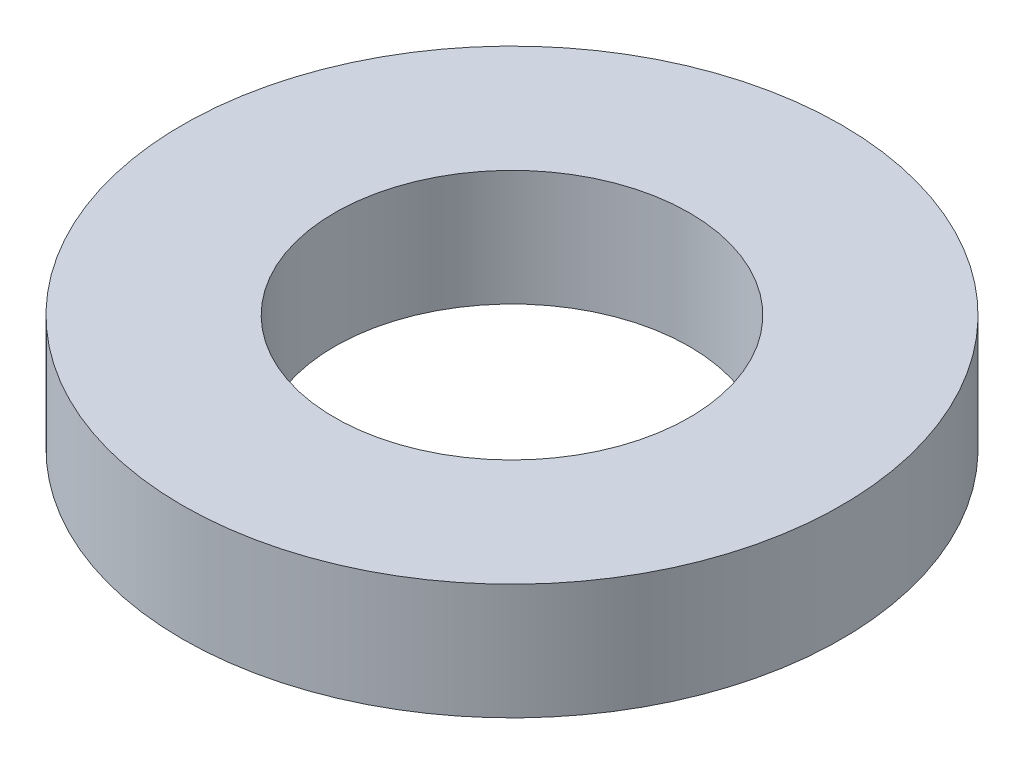
ISO-10303-21;
HEADER;
FILE_DESCRIPTION(('STEP AP214'),'2;1');
FILE_NAME('part.step','',(''),(''),'','','');
FILE_SCHEMA(('AUTOMOTIVE_DESIGN { 1 0 10303 214 1 1 1 1 }'));
ENDSEC;
DATA;
#1=APPLICATION_CONTEXT('core data for automotive mechanical design processes');
#2=APPLICATION_PROTOCOL_DEFINITION('international standard','automotive_design',2000,#1);
#3=PRODUCT_CONTEXT('',#1,'mechanical');
#4=PRODUCT('Part','Part','',(#3));
#5=PRODUCT_RELATED_PRODUCT_CATEGORY('part','',(#4));
#6=PRODUCT_DEFINITION_FORMATION('','',#4);
#7=PRODUCT_DEFINITION_CONTEXT('part definition',#1,'design');
#8=PRODUCT_DEFINITION('design','',#6,#7);
#9=PRODUCT_DEFINITION_SHAPE('','',#8);
#10=(LENGTH_UNIT() NAMED_UNIT(*) SI_UNIT(.MILLI.,.METRE.));
#11=(NAMED_UNIT(*) PLANE_ANGLE_UNIT() SI_UNIT($,.RADIAN.));
#12=(NAMED_UNIT(*) SI_UNIT($,.STERADIAN.) SOLID_ANGLE_UNIT());
#13=UNCERTAINTY_MEASURE_WITH_UNIT(LENGTH_MEASURE(1.E-05),#10,'distance_accuracy_value','');
#14=(GEOMETRIC_REPRESENTATION_CONTEXT(3) GLOBAL_UNCERTAINTY_ASSIGNED_CONTEXT((#13)) GLOBAL_UNIT_ASSIGNED_CONTEXT((#10,
#11,#12)) REPRESENTATION_CONTEXT('',''));
#15=CARTESIAN_POINT('',(0.,0.,0.));
#16=DIRECTION('',(0.,0.,1.));
#17=DIRECTION('',(1.,0.,0.));
#18=AXIS2_PLACEMENT_3D('',#15,#16,#17);
#19=CARTESIAN_POINT('',(0.,1.5748,0.));
#20=DIRECTION('',(0.,1.,0.));
#21=DIRECTION('',(0.,0.,1.));
#22=AXIS2_PLACEMENT_3D('',#19,#20,#21);
#23=PLANE('',#22);
#24=CARTESIAN_POINT('',(0.,1.5748,0.));
#25=DIRECTION('',(0.,-1.,0.));
#26=DIRECTION('',(0.,0.,-1.));
#27=AXIS2_PLACEMENT_3D('',#24,#25,#26);
#28=CIRCLE('',#27,2.413);
#29=CARTESIAN_POINT('',(0.,1.5748,-2.413));
#30=VERTEX_POINT('',#29);
#31=EDGE_CURVE('E27',#30,#30,#28,.T.);
#32=ORIENTED_EDGE('',*,*,#31,.T.);
#33=EDGE_LOOP('',(#32));
#34=FACE_BOUND('',#33,.T.);
#35=CARTESIAN_POINT('',(0.,1.5748,0.));
#36=DIRECTION('',(0.,-1.,0.));
#37=DIRECTION('',(0.,0.,-1.));
#38=AXIS2_PLACEMENT_3D('',#35,#36,#37);
#39=CIRCLE('',#38,4.4831);
#40=CARTESIAN_POINT('',(0.,1.5748,-4.4831));
#41=VERTEX_POINT('',#40);
#42=EDGE_CURVE('E18',#41,#41,#39,.T.);
#43=ORIENTED_EDGE('',*,*,#42,.F.);
#44=EDGE_LOOP('',(#43));
#45=FACE_BOUND('',#44,.T.);
#46=ADVANCED_FACE('F15',(#34,#45),#23,.T.);
#47=CARTESIAN_POINT('',(0.,1.5748,0.));
#48=DIRECTION('',(0.,-1.,0.));
#49=DIRECTION('',(0.,0.,-1.));
#50=AXIS2_PLACEMENT_3D('',#47,#48,#49);
#51=CYLINDRICAL_SURFACE('',#50,4.4831);
#52=ORIENTED_EDGE('',*,*,#42,.T.);
#53=EDGE_LOOP('',(#52));
#54=FACE_BOUND('',#53,.T.);
#55=CARTESIAN_POINT('',(0.,0.,0.));
#56=DIRECTION('',(0.,-1.,0.));
#57=DIRECTION('',(0.,0.,-1.));
#58=AXIS2_PLACEMENT_3D('',#55,#56,#57);
#59=CIRCLE('',#58,4.4831);
#60=CARTESIAN_POINT('',(0.,0.,-4.4831));
#61=VERTEX_POINT('',#60);
#62=EDGE_CURVE('E22',#61,#61,#59,.F.);
#63=ORIENTED_EDGE('',*,*,#62,.T.);
#64=EDGE_LOOP('',(#63));
#65=FACE_BOUND('',#64,.T.);
#66=ADVANCED_FACE('F35',(#54,#65),#51,.T.);
#67=CARTESIAN_POINT('',(0.,1.5748,0.));
#68=DIRECTION('',(0.,-1.,0.));
#69=DIRECTION('',(0.,0.,-1.));
#70=AXIS2_PLACEMENT_3D('',#67,#68,#69);
#71=CYLINDRICAL_SURFACE('',#70,2.413);
#72=CARTESIAN_POINT('',(0.,0.,0.));
#73=DIRECTION('',(0.,-1.,0.));
#74=DIRECTION('',(0.,0.,-1.));
#75=AXIS2_PLACEMENT_3D('',#72,#73,#74);
#76=CIRCLE('',#75,2.413);
#77=CARTESIAN_POINT('',(0.,0.,-2.413));
#78=VERTEX_POINT('',#77);
#79=EDGE_CURVE('E10',#78,#78,#76,.T.);
#80=ORIENTED_EDGE('',*,*,#79,.T.);
#81=EDGE_LOOP('',(#80));
#82=FACE_BOUND('',#81,.T.);
#83=ORIENTED_EDGE('',*,*,#31,.F.);
#84=EDGE_LOOP('',(#83));
#85=FACE_BOUND('',#84,.T.);
#86=ADVANCED_FACE('F43',(#82,#85),#71,.F.);
#87=CARTESIAN_POINT('',(0.,0.,0.));
#88=DIRECTION('',(0.,1.,0.));
#89=DIRECTION('',(0.,0.,1.));
#90=AXIS2_PLACEMENT_3D('',#87,#88,#89);
#91=PLANE('',#90);
#92=ORIENTED_EDGE('',*,*,#79,.F.);
#93=EDGE_LOOP('',(#92));
#94=FACE_BOUND('',#93,.T.);
#95=ORIENTED_EDGE('',*,*,#62,.F.);
#96=EDGE_LOOP('',(#95));
#97=FACE_BOUND('',#96,.T.);
#98=ADVANCED_FACE('F44',(#94,#97),#91,.F.);
#99=CLOSED_SHELL('',(#46,#66,#86,#98));
#100=MANIFOLD_SOLID_BREP('B1',#99);
#101=ADVANCED_BREP_SHAPE_REPRESENTATION('',(#18,#100),#14);
#102=SHAPE_DEFINITION_REPRESENTATION(#9,#101);
ENDSEC;
END-ISO-10303-21;
